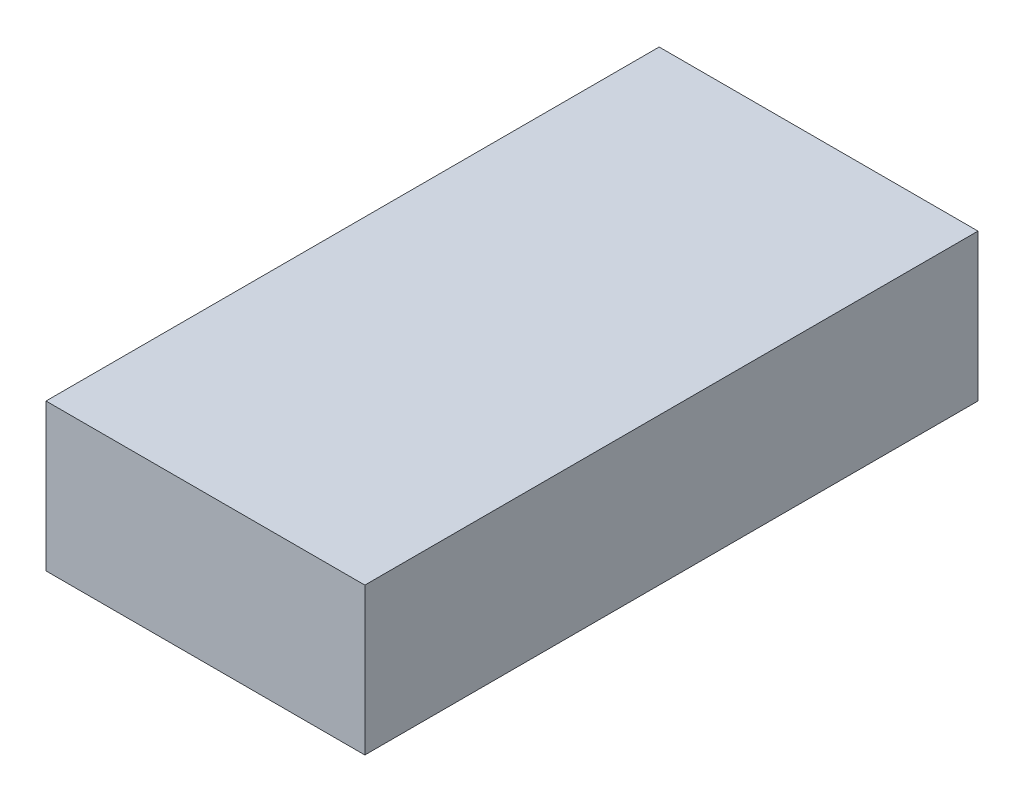
ISO-10303-21;
HEADER;
FILE_DESCRIPTION(('STEP AP214'),'2;1');
FILE_NAME('part.step','',(''),(''),'','','');
FILE_SCHEMA(('AUTOMOTIVE_DESIGN { 1 0 10303 214 1 1 1 1 }'));
ENDSEC;
DATA;
#1=APPLICATION_CONTEXT('core data for automotive mechanical design processes');
#2=APPLICATION_PROTOCOL_DEFINITION('international standard','automotive_design',2000,#1);
#3=PRODUCT_CONTEXT('',#1,'mechanical');
#4=PRODUCT('Part','Part','',(#3));
#5=PRODUCT_RELATED_PRODUCT_CATEGORY('part','',(#4));
#6=PRODUCT_DEFINITION_FORMATION('','',#4);
#7=PRODUCT_DEFINITION_CONTEXT('part definition',#1,'design');
#8=PRODUCT_DEFINITION('design','',#6,#7);
#9=PRODUCT_DEFINITION_SHAPE('','',#8);
#10=(LENGTH_UNIT() NAMED_UNIT(*) SI_UNIT(.MILLI.,.METRE.));
#11=(NAMED_UNIT(*) PLANE_ANGLE_UNIT() SI_UNIT($,.RADIAN.));
#12=(NAMED_UNIT(*) SI_UNIT($,.STERADIAN.) SOLID_ANGLE_UNIT());
#13=UNCERTAINTY_MEASURE_WITH_UNIT(LENGTH_MEASURE(1.E-05),#10,'distance_accuracy_value','');
#14=(GEOMETRIC_REPRESENTATION_CONTEXT(3) GLOBAL_UNCERTAINTY_ASSIGNED_CONTEXT((#13)) GLOBAL_UNIT_ASSIGNED_CONTEXT((#10,
#11,#12)) REPRESENTATION_CONTEXT('',''));
#15=CARTESIAN_POINT('',(0.,0.,0.));
#16=DIRECTION('',(0.,0.,1.));
#17=DIRECTION('',(1.,0.,0.));
#18=AXIS2_PLACEMENT_3D('',#15,#16,#17);
#19=CARTESIAN_POINT('',(13.,12.,25.));
#20=DIRECTION('',(-1.,0.,0.));
#21=DIRECTION('',(0.,0.,1.));
#22=AXIS2_PLACEMENT_3D('',#19,#20,#21);
#23=PLANE('',#22);
#24=DIRECTION('',(0.,0.,-1.));
#25=VECTOR('',#24,1.);
#26=CARTESIAN_POINT('',(13.,0.,25.));
#27=LINE('',#26,#25);
#28=CARTESIAN_POINT('',(13.,0.,25.));
#29=VERTEX_POINT('',#28);
#30=CARTESIAN_POINT('',(13.,0.,-25.));
#31=VERTEX_POINT('',#30);
#32=EDGE_CURVE('E102',#29,#31,#27,.T.);
#33=ORIENTED_EDGE('',*,*,#32,.T.);
#34=DIRECTION('',(0.,-1.,0.));
#35=VECTOR('',#34,1.);
#36=CARTESIAN_POINT('',(13.,12.,-25.));
#37=LINE('',#36,#35);
#38=CARTESIAN_POINT('',(13.,12.,-25.));
#39=VERTEX_POINT('',#38);
#40=EDGE_CURVE('E11',#39,#31,#37,.T.);
#41=ORIENTED_EDGE('',*,*,#40,.F.);
#42=DIRECTION('',(0.,0.,-1.));
#43=VECTOR('',#42,1.);
#44=CARTESIAN_POINT('',(13.,12.,25.));
#45=LINE('',#44,#43);
#46=CARTESIAN_POINT('',(13.,12.,25.));
#47=VERTEX_POINT('',#46);
#48=EDGE_CURVE('E90',#47,#39,#45,.T.);
#49=ORIENTED_EDGE('',*,*,#48,.F.);
#50=DIRECTION('',(0.,-1.,0.));
#51=VECTOR('',#50,1.);
#52=CARTESIAN_POINT('',(13.,12.,25.));
#53=LINE('',#52,#51);
#54=EDGE_CURVE('E98',#47,#29,#53,.T.);
#55=ORIENTED_EDGE('',*,*,#54,.T.);
#56=EDGE_LOOP('',(#33,#41,#49,#55));
#57=FACE_BOUND('',#56,.T.);
#58=ADVANCED_FACE('F39',(#57),#23,.F.);
#59=CARTESIAN_POINT('',(-13.,12.,-25.));
#60=DIRECTION('',(0.,0.,1.));
#61=DIRECTION('',(1.,0.,0.));
#62=AXIS2_PLACEMENT_3D('',#59,#60,#61);
#63=PLANE('',#62);
#64=DIRECTION('',(-1.,0.,0.));
#65=VECTOR('',#64,1.);
#66=CARTESIAN_POINT('',(-13.,0.,-25.));
#67=LINE('',#66,#65);
#68=CARTESIAN_POINT('',(-13.,0.,-25.));
#69=VERTEX_POINT('',#68);
#70=EDGE_CURVE('E94',#31,#69,#67,.T.);
#71=ORIENTED_EDGE('',*,*,#70,.T.);
#72=DIRECTION('',(0.,-1.,0.));
#73=VECTOR('',#72,1.);
#74=CARTESIAN_POINT('',(-13.,12.,-25.));
#75=LINE('',#74,#73);
#76=CARTESIAN_POINT('',(-13.,12.,-25.));
#77=VERTEX_POINT('',#76);
#78=EDGE_CURVE('E47',#77,#69,#75,.T.);
#79=ORIENTED_EDGE('',*,*,#78,.F.);
#80=DIRECTION('',(-1.,0.,0.));
#81=VECTOR('',#80,1.);
#82=CARTESIAN_POINT('',(-13.,12.,-25.));
#83=LINE('',#82,#81);
#84=EDGE_CURVE('E85',#39,#77,#83,.T.);
#85=ORIENTED_EDGE('',*,*,#84,.F.);
#86=ORIENTED_EDGE('',*,*,#40,.T.);
#87=EDGE_LOOP('',(#71,#79,#85,#86));
#88=FACE_BOUND('',#87,.T.);
#89=ADVANCED_FACE('F93',(#88),#63,.F.);
#90=CARTESIAN_POINT('',(-13.,12.,25.));
#91=DIRECTION('',(1.,0.,0.));
#92=DIRECTION('',(0.,0.,-1.));
#93=AXIS2_PLACEMENT_3D('',#90,#91,#92);
#94=PLANE('',#93);
#95=DIRECTION('',(0.,0.,1.));
#96=VECTOR('',#95,1.);
#97=CARTESIAN_POINT('',(-13.,0.,25.));
#98=LINE('',#97,#96);
#99=CARTESIAN_POINT('',(-13.,0.,25.));
#100=VERTEX_POINT('',#99);
#101=EDGE_CURVE('E72',#69,#100,#98,.T.);
#102=ORIENTED_EDGE('',*,*,#101,.T.);
#103=DIRECTION('',(0.,-1.,0.));
#104=VECTOR('',#103,1.);
#105=CARTESIAN_POINT('',(-13.,12.,25.));
#106=LINE('',#105,#104);
#107=CARTESIAN_POINT('',(-13.,12.,25.));
#108=VERTEX_POINT('',#107);
#109=EDGE_CURVE('E95',#108,#100,#106,.T.);
#110=ORIENTED_EDGE('',*,*,#109,.F.);
#111=DIRECTION('',(0.,0.,1.));
#112=VECTOR('',#111,1.);
#113=CARTESIAN_POINT('',(-13.,12.,25.));
#114=LINE('',#113,#112);
#115=EDGE_CURVE('E88',#77,#108,#114,.T.);
#116=ORIENTED_EDGE('',*,*,#115,.F.);
#117=ORIENTED_EDGE('',*,*,#78,.T.);
#118=EDGE_LOOP('',(#102,#110,#116,#117));
#119=FACE_BOUND('',#118,.T.);
#120=ADVANCED_FACE('F96',(#119),#94,.F.);
#121=CARTESIAN_POINT('',(-13.,12.,25.));
#122=DIRECTION('',(0.,0.,-1.));
#123=DIRECTION('',(-1.,0.,0.));
#124=AXIS2_PLACEMENT_3D('',#121,#122,#123);
#125=PLANE('',#124);
#126=DIRECTION('',(1.,0.,0.));
#127=VECTOR('',#126,1.);
#128=CARTESIAN_POINT('',(-13.,0.,25.));
#129=LINE('',#128,#127);
#130=EDGE_CURVE('E78',#100,#29,#129,.T.);
#131=ORIENTED_EDGE('',*,*,#130,.T.);
#132=ORIENTED_EDGE('',*,*,#54,.F.);
#133=DIRECTION('',(1.,0.,0.));
#134=VECTOR('',#133,1.);
#135=CARTESIAN_POINT('',(-13.,12.,25.));
#136=LINE('',#135,#134);
#137=EDGE_CURVE('E55',#108,#47,#136,.T.);
#138=ORIENTED_EDGE('',*,*,#137,.F.);
#139=ORIENTED_EDGE('',*,*,#109,.T.);
#140=EDGE_LOOP('',(#131,#132,#138,#139));
#141=FACE_BOUND('',#140,.T.);
#142=ADVANCED_FACE('F109',(#141),#125,.F.);
#143=CARTESIAN_POINT('',(0.,12.,0.));
#144=DIRECTION('',(0.,-1.,0.));
#145=DIRECTION('',(0.,0.,-1.));
#146=AXIS2_PLACEMENT_3D('',#143,#144,#145);
#147=PLANE('',#146);
#148=ORIENTED_EDGE('',*,*,#48,.T.);
#149=ORIENTED_EDGE('',*,*,#84,.T.);
#150=ORIENTED_EDGE('',*,*,#115,.T.);
#151=ORIENTED_EDGE('',*,*,#137,.T.);
#152=EDGE_LOOP('',(#148,#149,#150,#151));
#153=FACE_BOUND('',#152,.T.);
#154=ADVANCED_FACE('F86',(#153),#147,.F.);
#155=CARTESIAN_POINT('',(0.,0.,0.));
#156=DIRECTION('',(0.,-1.,0.));
#157=DIRECTION('',(0.,0.,-1.));
#158=AXIS2_PLACEMENT_3D('',#155,#156,#157);
#159=PLANE('',#158);
#160=ORIENTED_EDGE('',*,*,#32,.F.);
#161=ORIENTED_EDGE('',*,*,#130,.F.);
#162=ORIENTED_EDGE('',*,*,#101,.F.);
#163=ORIENTED_EDGE('',*,*,#70,.F.);
#164=EDGE_LOOP('',(#160,#161,#162,#163));
#165=FACE_BOUND('',#164,.T.);
#166=ADVANCED_FACE('F112',(#165),#159,.T.);
#167=CLOSED_SHELL('',(#58,#89,#120,#142,#154,#166));
#168=MANIFOLD_SOLID_BREP('B2',#167);
#169=ADVANCED_BREP_SHAPE_REPRESENTATION('',(#18,#168),#14);
#170=SHAPE_DEFINITION_REPRESENTATION(#9,#169);
ENDSEC;
END-ISO-10303-21;
